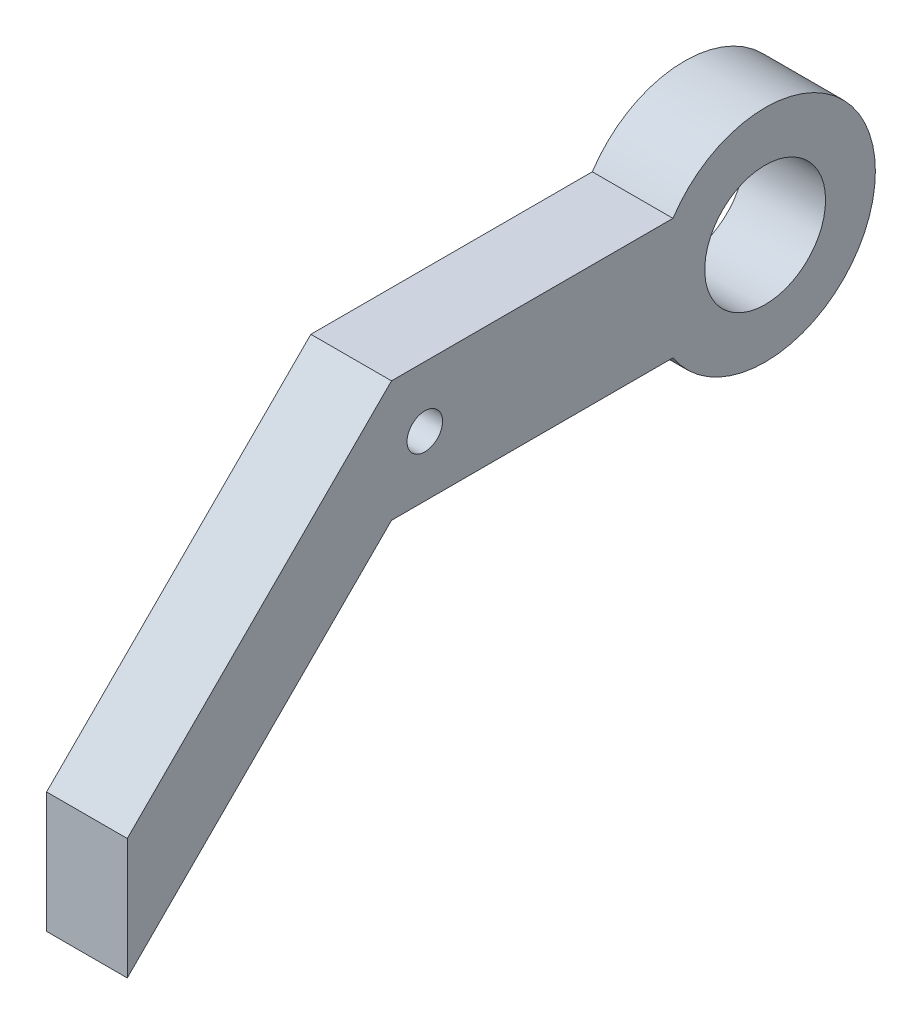
ISO-10303-21;
HEADER;
FILE_DESCRIPTION(('STEP AP214'),'2;1');
FILE_NAME('part.step','',(''),(''),'','','');
FILE_SCHEMA(('AUTOMOTIVE_DESIGN { 1 0 10303 214 1 1 1 1 }'));
ENDSEC;
DATA;
#1=APPLICATION_CONTEXT('core data for automotive mechanical design processes');
#2=APPLICATION_PROTOCOL_DEFINITION('international standard','automotive_design',2000,#1);
#3=PRODUCT_CONTEXT('',#1,'mechanical');
#4=PRODUCT('Part','Part','',(#3));
#5=PRODUCT_RELATED_PRODUCT_CATEGORY('part','',(#4));
#6=PRODUCT_DEFINITION_FORMATION('','',#4);
#7=PRODUCT_DEFINITION_CONTEXT('part definition',#1,'design');
#8=PRODUCT_DEFINITION('design','',#6,#7);
#9=PRODUCT_DEFINITION_SHAPE('','',#8);
#10=(LENGTH_UNIT() NAMED_UNIT(*) SI_UNIT(.MILLI.,.METRE.));
#11=(NAMED_UNIT(*) PLANE_ANGLE_UNIT() SI_UNIT($,.RADIAN.));
#12=(NAMED_UNIT(*) SI_UNIT($,.STERADIAN.) SOLID_ANGLE_UNIT());
#13=UNCERTAINTY_MEASURE_WITH_UNIT(LENGTH_MEASURE(1.E-05),#10,'distance_accuracy_value','');
#14=(GEOMETRIC_REPRESENTATION_CONTEXT(3) GLOBAL_UNCERTAINTY_ASSIGNED_CONTEXT((#13)) GLOBAL_UNIT_ASSIGNED_CONTEXT((#10,
#11,#12)) REPRESENTATION_CONTEXT('',''));
#15=CARTESIAN_POINT('',(0.,0.,0.));
#16=DIRECTION('',(0.,0.,1.));
#17=DIRECTION('',(1.,0.,0.));
#18=AXIS2_PLACEMENT_3D('',#15,#16,#17);
#19=CARTESIAN_POINT('',(-21.8159057690464,12.589280287183,6.37575416693902));
#20=DIRECTION('',(-1.,0.,0.));
#21=DIRECTION('',(0.,0.,1.));
#22=AXIS2_PLACEMENT_3D('',#19,#20,#21);
#23=PLANE('',#22);
#24=CARTESIAN_POINT('',(-21.8159057690464,12.589280287183,6.37575416693902));
#25=DIRECTION('',(1.,0.,0.));
#26=DIRECTION('',(0.,0.,-1.));
#27=AXIS2_PLACEMENT_3D('',#24,#25,#26);
#28=CIRCLE('',#27,8.85);
#29=CARTESIAN_POINT('',(-21.8159057690464,7.73928028718298,13.7784563762677));
#30=VERTEX_POINT('',#29);
#31=CARTESIAN_POINT('',(-21.8159057690464,17.439280287183,13.7784563762677));
#32=VERTEX_POINT('',#31);
#33=EDGE_CURVE('E104',#30,#32,#28,.T.);
#34=ORIENTED_EDGE('',*,*,#33,.T.);
#35=DIRECTION('',(0.,0.,-1.));
#36=VECTOR('',#35,1.);
#37=CARTESIAN_POINT('',(-21.8159057690464,17.439280287183,0.));
#38=LINE('',#37,#36);
#39=CARTESIAN_POINT('',(-21.8159057690464,17.439280287183,36.375754166939));
#40=VERTEX_POINT('',#39);
#41=EDGE_CURVE('E111',#40,#32,#38,.T.);
#42=ORIENTED_EDGE('',*,*,#41,.F.);
#43=DIRECTION('',(0.,-0.707106781186546,0.707106781186549));
#44=VECTOR('',#43,1.);
#45=CARTESIAN_POINT('',(-21.8159057690464,17.439280287183,36.375754166939));
#46=LINE('',#45,#44);
#47=CARTESIAN_POINT('',(-21.8159057690464,-3.77392314841336,57.5889576025354));
#48=VERTEX_POINT('',#47);
#49=EDGE_CURVE('E67',#40,#48,#46,.T.);
#50=ORIENTED_EDGE('',*,*,#49,.T.);
#51=DIRECTION('',(0.,-1.,0.));
#52=VECTOR('',#51,1.);
#53=CARTESIAN_POINT('',(-21.8159057690464,-3.77392314841336,57.5889576025354));
#54=LINE('',#53,#52);
#55=CARTESIAN_POINT('',(-21.8159057690463,-13.4739231484134,57.5889576025355));
#56=VERTEX_POINT('',#55);
#57=EDGE_CURVE('E128',#48,#56,#54,.T.);
#58=ORIENTED_EDGE('',*,*,#57,.T.);
#59=DIRECTION('',(0.,0.707106781186545,-0.70710678118655));
#60=VECTOR('',#59,1.);
#61=CARTESIAN_POINT('',(-21.8159057690464,-13.4739231484134,57.5889576025355));
#62=LINE('',#61,#60);
#63=CARTESIAN_POINT('',(-21.8159057690464,7.73928028718298,36.375754166939));
#64=VERTEX_POINT('',#63);
#65=EDGE_CURVE('E106',#56,#64,#62,.T.);
#66=ORIENTED_EDGE('',*,*,#65,.T.);
#67=DIRECTION('',(0.,0.,-1.));
#68=VECTOR('',#67,1.);
#69=CARTESIAN_POINT('',(-21.8159057690464,7.73928028718298,0.));
#70=LINE('',#69,#68);
#71=EDGE_CURVE('E100',#64,#30,#70,.T.);
#72=ORIENTED_EDGE('',*,*,#71,.T.);
#73=EDGE_LOOP('',(#34,#42,#50,#58,#66,#72));
#74=FACE_BOUND('',#73,.T.);
#75=CARTESIAN_POINT('',(-21.8159057690464,12.589280287183,6.37575416693902));
#76=DIRECTION('',(1.,0.,0.));
#77=DIRECTION('',(0.,0.,-1.));
#78=AXIS2_PLACEMENT_3D('',#75,#76,#77);
#79=CIRCLE('',#78,4.85);
#80=CARTESIAN_POINT('',(-21.8159057690464,12.589280287183,1.52575416693902));
#81=VERTEX_POINT('',#80);
#82=EDGE_CURVE('E110',#81,#81,#79,.T.);
#83=ORIENTED_EDGE('',*,*,#82,.F.);
#84=EDGE_LOOP('',(#83));
#85=FACE_BOUND('',#84,.T.);
#86=CARTESIAN_POINT('',(-21.8159057690464,12.589280287183,33.700754166939));
#87=DIRECTION('',(-1.,0.,0.));
#88=DIRECTION('',(0.,0.,1.));
#89=AXIS2_PLACEMENT_3D('',#86,#87,#88);
#90=CIRCLE('',#89,1.425);
#91=CARTESIAN_POINT('',(-21.8159057690464,12.589280287183,35.125754166939));
#92=VERTEX_POINT('',#91);
#93=EDGE_CURVE('E147',#92,#92,#90,.T.);
#94=ORIENTED_EDGE('',*,*,#93,.T.);
#95=EDGE_LOOP('',(#94));
#96=FACE_BOUND('',#95,.T.);
#97=ADVANCED_FACE('F53',(#74,#85,#96),#23,.F.);
#98=CARTESIAN_POINT('',(-28.2909057690464,12.589280287183,6.37575416693902));
#99=DIRECTION('',(1.,0.,0.));
#100=DIRECTION('',(0.,0.,-1.));
#101=AXIS2_PLACEMENT_3D('',#98,#99,#100);
#102=PLANE('',#101);
#103=DIRECTION('',(0.,0.,1.));
#104=VECTOR('',#103,1.);
#105=CARTESIAN_POINT('',(-28.2909057690464,17.439280287183,0.));
#106=LINE('',#105,#104);
#107=CARTESIAN_POINT('',(-28.2909057690464,17.439280287183,13.7784563762677));
#108=VERTEX_POINT('',#107);
#109=CARTESIAN_POINT('',(-28.2909057690464,17.439280287183,36.375754166939));
#110=VERTEX_POINT('',#109);
#111=EDGE_CURVE('E153',#108,#110,#106,.T.);
#112=ORIENTED_EDGE('',*,*,#111,.F.);
#113=CARTESIAN_POINT('',(-28.2909057690464,12.589280287183,6.37575416693902));
#114=DIRECTION('',(1.,0.,0.));
#115=DIRECTION('',(0.,0.,-1.));
#116=AXIS2_PLACEMENT_3D('',#113,#114,#115);
#117=CIRCLE('',#116,8.85);
#118=CARTESIAN_POINT('',(-28.2909057690464,7.73928028718298,13.7784563762677));
#119=VERTEX_POINT('',#118);
#120=EDGE_CURVE('E12',#119,#108,#117,.T.);
#121=ORIENTED_EDGE('',*,*,#120,.F.);
#122=DIRECTION('',(0.,0.,1.));
#123=VECTOR('',#122,1.);
#124=CARTESIAN_POINT('',(-28.2909057690464,7.73928028718298,0.));
#125=LINE('',#124,#123);
#126=CARTESIAN_POINT('',(-28.2909057690464,7.73928028718298,36.375754166939));
#127=VERTEX_POINT('',#126);
#128=EDGE_CURVE('E116',#119,#127,#125,.T.);
#129=ORIENTED_EDGE('',*,*,#128,.T.);
#130=DIRECTION('',(0.,-0.707106781186545,0.70710678118655));
#131=VECTOR('',#130,1.);
#132=CARTESIAN_POINT('',(-28.2909057690464,-13.4739231484134,57.5889576025355));
#133=LINE('',#132,#131);
#134=CARTESIAN_POINT('',(-28.2909057690464,-13.4739231484134,57.5889576025355));
#135=VERTEX_POINT('',#134);
#136=EDGE_CURVE('E126',#127,#135,#133,.T.);
#137=ORIENTED_EDGE('',*,*,#136,.T.);
#138=DIRECTION('',(0.,1.,0.));
#139=VECTOR('',#138,1.);
#140=CARTESIAN_POINT('',(-28.2909057690464,-3.77392314841336,57.5889576025354));
#141=LINE('',#140,#139);
#142=CARTESIAN_POINT('',(-28.2909057690464,-3.77392314841336,57.5889576025354));
#143=VERTEX_POINT('',#142);
#144=EDGE_CURVE('E134',#135,#143,#141,.T.);
#145=ORIENTED_EDGE('',*,*,#144,.T.);
#146=DIRECTION('',(0.,0.707106781186546,-0.707106781186549));
#147=VECTOR('',#146,1.);
#148=CARTESIAN_POINT('',(-28.2909057690464,17.439280287183,36.375754166939));
#149=LINE('',#148,#147);
#150=EDGE_CURVE('E137',#143,#110,#149,.T.);
#151=ORIENTED_EDGE('',*,*,#150,.T.);
#152=EDGE_LOOP('',(#112,#121,#129,#137,#145,#151));
#153=FACE_BOUND('',#152,.T.);
#154=CARTESIAN_POINT('',(-28.2909057690464,12.589280287183,6.37575416693902));
#155=DIRECTION('',(1.,0.,0.));
#156=DIRECTION('',(0.,0.,-1.));
#157=AXIS2_PLACEMENT_3D('',#154,#155,#156);
#158=CIRCLE('',#157,4.85);
#159=CARTESIAN_POINT('',(-28.2909057690464,12.589280287183,1.52575416693902));
#160=VERTEX_POINT('',#159);
#161=EDGE_CURVE('E61',#160,#160,#158,.F.);
#162=ORIENTED_EDGE('',*,*,#161,.F.);
#163=EDGE_LOOP('',(#162));
#164=FACE_BOUND('',#163,.T.);
#165=CARTESIAN_POINT('',(-28.2909057690464,12.589280287183,33.700754166939));
#166=DIRECTION('',(-1.,0.,0.));
#167=DIRECTION('',(0.,0.,1.));
#168=AXIS2_PLACEMENT_3D('',#165,#166,#167);
#169=CIRCLE('',#168,1.425);
#170=CARTESIAN_POINT('',(-28.2909057690464,12.589280287183,35.125754166939));
#171=VERTEX_POINT('',#170);
#172=EDGE_CURVE('E144',#171,#171,#169,.T.);
#173=ORIENTED_EDGE('',*,*,#172,.F.);
#174=EDGE_LOOP('',(#173));
#175=FACE_BOUND('',#174,.T.);
#176=ADVANCED_FACE('F166',(#153,#164,#175),#102,.F.);
#177=CARTESIAN_POINT('',(-50.2964980867219,12.589280287183,6.37575416693902));
#178=DIRECTION('',(1.,0.,0.));
#179=DIRECTION('',(0.,0.,-1.));
#180=AXIS2_PLACEMENT_3D('',#177,#178,#179);
#181=CYLINDRICAL_SURFACE('',#180,4.85);
#182=CARTESIAN_POINT('',(-28.2909057690464,12.589280287183,1.52575416693902));
#183=CARTESIAN_POINT('',(-28.2234578523797,12.589280287183,1.52575416693902));
#184=CARTESIAN_POINT('',(-28.156009935713,12.589280287183,1.52575416693902));
#185=CARTESIAN_POINT('',(-28.0211141023797,12.589280287183,1.52575416693902));
#186=CARTESIAN_POINT('',(-27.953666185713,12.589280287183,1.52575416693902));
#187=CARTESIAN_POINT('',(-27.8187703523797,12.589280287183,1.52575416693902));
#188=CARTESIAN_POINT('',(-27.751322435713,12.589280287183,1.52575416693902));
#189=CARTESIAN_POINT('',(-27.6164266023797,12.589280287183,1.52575416693902));
#190=CARTESIAN_POINT('',(-27.548978685713,12.589280287183,1.52575416693902));
#191=CARTESIAN_POINT('',(-27.4140828523797,12.589280287183,1.52575416693902));
#192=CARTESIAN_POINT('',(-27.346634935713,12.589280287183,1.52575416693902));
#193=CARTESIAN_POINT('',(-27.2117391023797,12.589280287183,1.52575416693902));
#194=CARTESIAN_POINT('',(-27.144291185713,12.589280287183,1.52575416693902));
#195=CARTESIAN_POINT('',(-27.0093953523797,12.589280287183,1.52575416693902));
#196=CARTESIAN_POINT('',(-26.941947435713,12.589280287183,1.52575416693902));
#197=CARTESIAN_POINT('',(-26.8070516023797,12.589280287183,1.52575416693902));
#198=CARTESIAN_POINT('',(-26.739603685713,12.589280287183,1.52575416693902));
#199=CARTESIAN_POINT('',(-26.6047078523797,12.589280287183,1.52575416693902));
#200=CARTESIAN_POINT('',(-26.537259935713,12.589280287183,1.52575416693902));
#201=CARTESIAN_POINT('',(-26.4023641023797,12.589280287183,1.52575416693902));
#202=CARTESIAN_POINT('',(-26.334916185713,12.589280287183,1.52575416693902));
#203=CARTESIAN_POINT('',(-26.2000203523797,12.589280287183,1.52575416693902));
#204=CARTESIAN_POINT('',(-26.132572435713,12.589280287183,1.52575416693902));
#205=CARTESIAN_POINT('',(-25.9976766023797,12.589280287183,1.52575416693902));
#206=CARTESIAN_POINT('',(-25.930228685713,12.589280287183,1.52575416693902));
#207=CARTESIAN_POINT('',(-25.7953328523797,12.589280287183,1.52575416693902));
#208=CARTESIAN_POINT('',(-25.727884935713,12.589280287183,1.52575416693902));
#209=CARTESIAN_POINT('',(-25.5929891023797,12.589280287183,1.52575416693902));
#210=CARTESIAN_POINT('',(-25.525541185713,12.589280287183,1.52575416693902));
#211=CARTESIAN_POINT('',(-25.3906453523797,12.589280287183,1.52575416693902));
#212=CARTESIAN_POINT('',(-25.323197435713,12.589280287183,1.52575416693902));
#213=CARTESIAN_POINT('',(-25.1883016023797,12.589280287183,1.52575416693902));
#214=CARTESIAN_POINT('',(-25.120853685713,12.589280287183,1.52575416693902));
#215=CARTESIAN_POINT('',(-24.9859578523797,12.589280287183,1.52575416693902));
#216=CARTESIAN_POINT('',(-24.918509935713,12.589280287183,1.52575416693902));
#217=CARTESIAN_POINT('',(-24.7836141023797,12.589280287183,1.52575416693902));
#218=CARTESIAN_POINT('',(-24.716166185713,12.589280287183,1.52575416693902));
#219=CARTESIAN_POINT('',(-24.5812703523797,12.589280287183,1.52575416693902));
#220=CARTESIAN_POINT('',(-24.513822435713,12.589280287183,1.52575416693902));
#221=CARTESIAN_POINT('',(-24.3789266023797,12.589280287183,1.52575416693902));
#222=CARTESIAN_POINT('',(-24.311478685713,12.589280287183,1.52575416693902));
#223=CARTESIAN_POINT('',(-24.1765828523797,12.589280287183,1.52575416693902));
#224=CARTESIAN_POINT('',(-24.109134935713,12.589280287183,1.52575416693902));
#225=CARTESIAN_POINT('',(-23.9742391023797,12.589280287183,1.52575416693902));
#226=CARTESIAN_POINT('',(-23.906791185713,12.589280287183,1.52575416693902));
#227=CARTESIAN_POINT('',(-23.7718953523797,12.589280287183,1.52575416693902));
#228=CARTESIAN_POINT('',(-23.704447435713,12.589280287183,1.52575416693902));
#229=CARTESIAN_POINT('',(-23.5695516023797,12.589280287183,1.52575416693902));
#230=CARTESIAN_POINT('',(-23.502103685713,12.589280287183,1.52575416693902));
#231=CARTESIAN_POINT('',(-23.3672078523797,12.589280287183,1.52575416693902));
#232=CARTESIAN_POINT('',(-23.299759935713,12.589280287183,1.52575416693902));
#233=CARTESIAN_POINT('',(-23.1648641023797,12.589280287183,1.52575416693902));
#234=CARTESIAN_POINT('',(-23.097416185713,12.589280287183,1.52575416693902));
#235=CARTESIAN_POINT('',(-22.9625203523797,12.589280287183,1.52575416693902));
#236=CARTESIAN_POINT('',(-22.895072435713,12.589280287183,1.52575416693902));
#237=CARTESIAN_POINT('',(-22.7601766023797,12.589280287183,1.52575416693902));
#238=CARTESIAN_POINT('',(-22.692728685713,12.589280287183,1.52575416693902));
#239=CARTESIAN_POINT('',(-22.5578328523797,12.589280287183,1.52575416693902));
#240=CARTESIAN_POINT('',(-22.490384935713,12.589280287183,1.52575416693902));
#241=CARTESIAN_POINT('',(-22.3554891023797,12.589280287183,1.52575416693902));
#242=CARTESIAN_POINT('',(-22.288041185713,12.589280287183,1.52575416693902));
#243=CARTESIAN_POINT('',(-22.1531453523797,12.589280287183,1.52575416693902));
#244=CARTESIAN_POINT('',(-22.085697435713,12.589280287183,1.52575416693902));
#245=CARTESIAN_POINT('',(-21.9508016023797,12.589280287183,1.52575416693902));
#246=CARTESIAN_POINT('',(-21.883353685713,12.589280287183,1.52575416693902));
#247=CARTESIAN_POINT('',(-21.8159057690464,12.589280287183,1.52575416693902));
#248=B_SPLINE_CURVE_WITH_KNOTS('',3,(#182,#183,#184,#185,#186,#187,#188,#189,#190,#191,#192,
#193,#194,#195,#196,#197,#198,#199,#200,#201,#202,#203,#204,#205,#206,#207,#208,#209,#210,#211,
#212,#213,#214,#215,#216,#217,#218,#219,#220,#221,#222,#223,#224,#225,#226,#227,#228,#229,#230,
#231,#232,#233,#234,#235,#236,#237,#238,#239,#240,#241,#242,#243,#244,#245,#246,#247),
.UNSPECIFIED.,.F.,.F.,(4,2,2,2,2,2,2,2,2,2,2,2,2,2,2,2,2,2,2,2,2,2,2,2,2,2,2,2,2,2,2,2,4),(0.,
0.20234375,0.404687500000001,0.607031250000001,0.809375000000001,1.01171875,1.2140625,
1.41640625,1.61875,1.82109375,2.0234375,2.22578125,2.428125,2.63046875,2.8328125,3.03515625,
3.2375,3.43984375,3.6421875,3.84453125,4.046875,4.24921875,4.4515625,4.65390625,4.85625,
5.05859375,5.2609375,5.46328125,5.665625,5.86796875,6.0703125,6.27265625,6.475),.UNSPECIFIED.);
#249=EDGE_CURVE('BSEAM163',#160,#81,#248,.T.);
#250=ORIENTED_EDGE('',*,*,#161,.T.);
#251=ORIENTED_EDGE('',*,*,#82,.T.);
#252=ORIENTED_EDGE('',*,*,#249,.T.);
#253=ORIENTED_EDGE('',*,*,#249,.F.);
#254=EDGE_LOOP('',(#250,#252,#251,#253));
#255=FACE_BOUND('',#254,.T.);
#256=ADVANCED_FACE('F163',(#255),#181,.F.);
#257=CARTESIAN_POINT('',(9.71328705284491,17.439280287183,0.));
#258=DIRECTION('',(0.,-1.,0.));
#259=DIRECTION('',(0.,0.,-1.));
#260=AXIS2_PLACEMENT_3D('',#257,#258,#259);
#261=PLANE('',#260);
#262=ORIENTED_EDGE('',*,*,#111,.T.);
#263=DIRECTION('',(-1.,0.,0.));
#264=VECTOR('',#263,1.);
#265=CARTESIAN_POINT('',(9.71328705284491,17.439280287183,36.375754166939));
#266=LINE('',#265,#264);
#267=EDGE_CURVE('E151',#40,#110,#266,.T.);
#268=ORIENTED_EDGE('',*,*,#267,.F.);
#269=ORIENTED_EDGE('',*,*,#41,.T.);
#270=DIRECTION('',(1.,0.,0.));
#271=VECTOR('',#270,1.);
#272=CARTESIAN_POINT('',(-31.8159057690464,17.439280287183,13.7784563762677));
#273=LINE('',#272,#271);
#274=EDGE_CURVE('E119',#108,#32,#273,.T.);
#275=ORIENTED_EDGE('',*,*,#274,.F.);
#276=EDGE_LOOP('',(#262,#268,#269,#275));
#277=FACE_BOUND('',#276,.T.);
#278=ADVANCED_FACE('F196',(#277),#261,.F.);
#279=CARTESIAN_POINT('',(9.71328705284491,7.73928028718298,0.));
#280=DIRECTION('',(0.,-1.,0.));
#281=DIRECTION('',(0.,0.,-1.));
#282=AXIS2_PLACEMENT_3D('',#279,#280,#281);
#283=PLANE('',#282);
#284=DIRECTION('',(1.,0.,0.));
#285=VECTOR('',#284,1.);
#286=CARTESIAN_POINT('',(-31.8159057690464,7.73928028718298,13.7784563762677));
#287=LINE('',#286,#285);
#288=EDGE_CURVE('E114',#119,#30,#287,.T.);
#289=ORIENTED_EDGE('',*,*,#288,.T.);
#290=ORIENTED_EDGE('',*,*,#71,.F.);
#291=DIRECTION('',(-1.,0.,0.));
#292=VECTOR('',#291,1.);
#293=CARTESIAN_POINT('',(9.71328705284491,7.73928028718298,36.375754166939));
#294=LINE('',#293,#292);
#295=EDGE_CURVE('E155',#64,#127,#294,.T.);
#296=ORIENTED_EDGE('',*,*,#295,.T.);
#297=ORIENTED_EDGE('',*,*,#128,.F.);
#298=EDGE_LOOP('',(#289,#290,#296,#297));
#299=FACE_BOUND('',#298,.T.);
#300=ADVANCED_FACE('F115',(#299),#283,.T.);
#301=CARTESIAN_POINT('',(-18.2909057690464,12.589280287183,33.700754166939));
#302=DIRECTION('',(-1.,0.,0.));
#303=DIRECTION('',(0.,0.,1.));
#304=AXIS2_PLACEMENT_3D('',#301,#302,#303);
#305=CYLINDRICAL_SURFACE('',#304,1.425);
#306=ORIENTED_EDGE('',*,*,#172,.T.);
#307=EDGE_LOOP('',(#306));
#308=FACE_BOUND('',#307,.T.);
#309=ORIENTED_EDGE('',*,*,#93,.F.);
#310=EDGE_LOOP('',(#309));
#311=FACE_BOUND('',#310,.T.);
#312=ADVANCED_FACE('F172',(#308,#311),#305,.F.);
#313=CARTESIAN_POINT('',(15.6757752635583,17.439280287183,36.375754166939));
#314=DIRECTION('',(0.,0.707106781186549,0.707106781186546));
#315=DIRECTION('',(0.,-0.707106781186546,0.707106781186549));
#316=AXIS2_PLACEMENT_3D('',#313,#314,#315);
#317=PLANE('',#316);
#318=ORIENTED_EDGE('',*,*,#49,.F.);
#319=ORIENTED_EDGE('',*,*,#267,.T.);
#320=ORIENTED_EDGE('',*,*,#150,.F.);
#321=DIRECTION('',(-1.,0.,0.));
#322=VECTOR('',#321,1.);
#323=CARTESIAN_POINT('',(15.6757752635583,-3.77392314841336,57.5889576025354));
#324=LINE('',#323,#322);
#325=EDGE_CURVE('E130',#48,#143,#324,.T.);
#326=ORIENTED_EDGE('',*,*,#325,.F.);
#327=EDGE_LOOP('',(#318,#319,#320,#326));
#328=FACE_BOUND('',#327,.T.);
#329=ADVANCED_FACE('F175',(#328),#317,.T.);
#330=CARTESIAN_POINT('',(15.6757752635583,-3.77392314841336,57.5889576025354));
#331=DIRECTION('',(0.,0.,1.));
#332=DIRECTION('',(0.,-1.,0.));
#333=AXIS2_PLACEMENT_3D('',#330,#331,#332);
#334=PLANE('',#333);
#335=ORIENTED_EDGE('',*,*,#57,.F.);
#336=ORIENTED_EDGE('',*,*,#325,.T.);
#337=ORIENTED_EDGE('',*,*,#144,.F.);
#338=DIRECTION('',(-1.,0.,0.));
#339=VECTOR('',#338,1.);
#340=CARTESIAN_POINT('',(15.6757752635583,-13.4739231484134,57.5889576025355));
#341=LINE('',#340,#339);
#342=EDGE_CURVE('E140',#56,#135,#341,.T.);
#343=ORIENTED_EDGE('',*,*,#342,.F.);
#344=EDGE_LOOP('',(#335,#336,#337,#343));
#345=FACE_BOUND('',#344,.T.);
#346=ADVANCED_FACE('F228',(#345),#334,.T.);
#347=CARTESIAN_POINT('',(15.6757752635583,-13.4739231484134,57.5889576025355));
#348=DIRECTION('',(0.,-0.70710678118655,-0.707106781186545));
#349=DIRECTION('',(0.,0.707106781186545,-0.70710678118655));
#350=AXIS2_PLACEMENT_3D('',#347,#348,#349);
#351=PLANE('',#350);
#352=ORIENTED_EDGE('',*,*,#65,.F.);
#353=ORIENTED_EDGE('',*,*,#342,.T.);
#354=ORIENTED_EDGE('',*,*,#136,.F.);
#355=ORIENTED_EDGE('',*,*,#295,.F.);
#356=EDGE_LOOP('',(#352,#353,#354,#355));
#357=FACE_BOUND('',#356,.T.);
#358=ADVANCED_FACE('F186',(#357),#351,.T.);
#359=CARTESIAN_POINT('',(-31.8159057690464,12.589280287183,6.37575416693902));
#360=DIRECTION('',(1.,0.,0.));
#361=DIRECTION('',(0.,0.,-1.));
#362=AXIS2_PLACEMENT_3D('',#359,#360,#361);
#363=CYLINDRICAL_SURFACE('',#362,8.85);
#364=ORIENTED_EDGE('',*,*,#120,.T.);
#365=ORIENTED_EDGE('',*,*,#274,.T.);
#366=ORIENTED_EDGE('',*,*,#33,.F.);
#367=ORIENTED_EDGE('',*,*,#288,.F.);
#368=EDGE_LOOP('',(#364,#365,#366,#367));
#369=FACE_BOUND('',#368,.T.);
#370=ADVANCED_FACE('F122',(#369),#363,.T.);
#371=CLOSED_SHELL('',(#97,#176,#256,#278,#300,#312,#329,#346,#358,#370));
#372=MANIFOLD_SOLID_BREP('B2',#371);
#373=ADVANCED_BREP_SHAPE_REPRESENTATION('',(#18,#372),#14);
#374=SHAPE_DEFINITION_REPRESENTATION(#9,#373);
ENDSEC;
END-ISO-10303-21;
